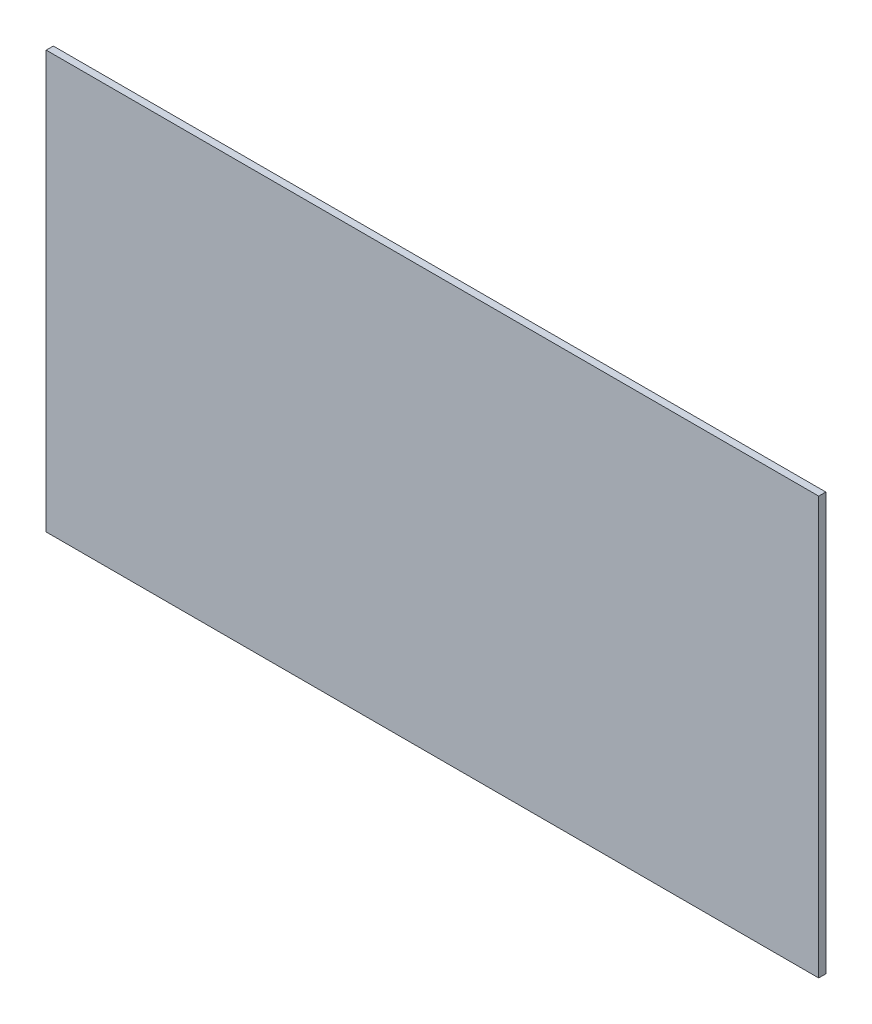
ISO-10303-21;
HEADER;
FILE_DESCRIPTION(('STEP AP214'),'2;1');
FILE_NAME('part.step','',(''),(''),'','','');
FILE_SCHEMA(('AUTOMOTIVE_DESIGN { 1 0 10303 214 1 1 1 1 }'));
ENDSEC;
DATA;
#1=APPLICATION_CONTEXT('core data for automotive mechanical design processes');
#2=APPLICATION_PROTOCOL_DEFINITION('international standard','automotive_design',2000,#1);
#3=PRODUCT_CONTEXT('',#1,'mechanical');
#4=PRODUCT('Part','Part','',(#3));
#5=PRODUCT_RELATED_PRODUCT_CATEGORY('part','',(#4));
#6=PRODUCT_DEFINITION_FORMATION('','',#4);
#7=PRODUCT_DEFINITION_CONTEXT('part definition',#1,'design');
#8=PRODUCT_DEFINITION('design','',#6,#7);
#9=PRODUCT_DEFINITION_SHAPE('','',#8);
#10=(LENGTH_UNIT() NAMED_UNIT(*) SI_UNIT(.MILLI.,.METRE.));
#11=(NAMED_UNIT(*) PLANE_ANGLE_UNIT() SI_UNIT($,.RADIAN.));
#12=(NAMED_UNIT(*) SI_UNIT($,.STERADIAN.) SOLID_ANGLE_UNIT());
#13=UNCERTAINTY_MEASURE_WITH_UNIT(LENGTH_MEASURE(1.E-05),#10,'distance_accuracy_value','');
#14=(GEOMETRIC_REPRESENTATION_CONTEXT(3) GLOBAL_UNCERTAINTY_ASSIGNED_CONTEXT((#13)) GLOBAL_UNIT_ASSIGNED_CONTEXT((#10,
#11,#12)) REPRESENTATION_CONTEXT('',''));
#15=CARTESIAN_POINT('',(0.,0.,0.));
#16=DIRECTION('',(0.,0.,1.));
#17=DIRECTION('',(1.,0.,0.));
#18=AXIS2_PLACEMENT_3D('',#15,#16,#17);
#19=CARTESIAN_POINT('',(217.5,117.5,4.));
#20=DIRECTION('',(-1.,0.,0.));
#21=DIRECTION('',(0.,0.,1.));
#22=AXIS2_PLACEMENT_3D('',#19,#20,#21);
#23=PLANE('',#22);
#24=DIRECTION('',(0.,1.,0.));
#25=VECTOR('',#24,1.);
#26=CARTESIAN_POINT('',(217.5,117.5,0.));
#27=LINE('',#26,#25);
#28=CARTESIAN_POINT('',(217.5,-117.5,0.));
#29=VERTEX_POINT('',#28);
#30=CARTESIAN_POINT('',(217.5,117.5,0.));
#31=VERTEX_POINT('',#30);
#32=EDGE_CURVE('E95',#29,#31,#27,.T.);
#33=ORIENTED_EDGE('',*,*,#32,.T.);
#34=DIRECTION('',(0.,0.,-1.));
#35=VECTOR('',#34,1.);
#36=CARTESIAN_POINT('',(217.5,117.5,4.));
#37=LINE('',#36,#35);
#38=CARTESIAN_POINT('',(217.5,117.5,4.));
#39=VERTEX_POINT('',#38);
#40=EDGE_CURVE('E11',#39,#31,#37,.T.);
#41=ORIENTED_EDGE('',*,*,#40,.F.);
#42=DIRECTION('',(0.,1.,0.));
#43=VECTOR('',#42,1.);
#44=CARTESIAN_POINT('',(217.5,117.5,4.));
#45=LINE('',#44,#43);
#46=CARTESIAN_POINT('',(217.5,-117.5,4.));
#47=VERTEX_POINT('',#46);
#48=EDGE_CURVE('E83',#47,#39,#45,.T.);
#49=ORIENTED_EDGE('',*,*,#48,.F.);
#50=DIRECTION('',(0.,0.,-1.));
#51=VECTOR('',#50,1.);
#52=CARTESIAN_POINT('',(217.5,-117.5,4.));
#53=LINE('',#52,#51);
#54=EDGE_CURVE('E91',#47,#29,#53,.T.);
#55=ORIENTED_EDGE('',*,*,#54,.T.);
#56=EDGE_LOOP('',(#33,#41,#49,#55));
#57=FACE_BOUND('',#56,.T.);
#58=ADVANCED_FACE('F32',(#57),#23,.F.);
#59=CARTESIAN_POINT('',(-217.5,117.5,4.));
#60=DIRECTION('',(0.,-1.,0.));
#61=DIRECTION('',(0.,0.,-1.));
#62=AXIS2_PLACEMENT_3D('',#59,#60,#61);
#63=PLANE('',#62);
#64=DIRECTION('',(-1.,0.,0.));
#65=VECTOR('',#64,1.);
#66=CARTESIAN_POINT('',(-217.5,117.5,0.));
#67=LINE('',#66,#65);
#68=CARTESIAN_POINT('',(-217.5,117.5,0.));
#69=VERTEX_POINT('',#68);
#70=EDGE_CURVE('E87',#31,#69,#67,.T.);
#71=ORIENTED_EDGE('',*,*,#70,.T.);
#72=DIRECTION('',(0.,0.,-1.));
#73=VECTOR('',#72,1.);
#74=CARTESIAN_POINT('',(-217.5,117.5,4.));
#75=LINE('',#74,#73);
#76=CARTESIAN_POINT('',(-217.5,117.5,4.));
#77=VERTEX_POINT('',#76);
#78=EDGE_CURVE('E40',#77,#69,#75,.T.);
#79=ORIENTED_EDGE('',*,*,#78,.F.);
#80=DIRECTION('',(-1.,0.,0.));
#81=VECTOR('',#80,1.);
#82=CARTESIAN_POINT('',(-217.5,117.5,4.));
#83=LINE('',#82,#81);
#84=EDGE_CURVE('E78',#39,#77,#83,.T.);
#85=ORIENTED_EDGE('',*,*,#84,.F.);
#86=ORIENTED_EDGE('',*,*,#40,.T.);
#87=EDGE_LOOP('',(#71,#79,#85,#86));
#88=FACE_BOUND('',#87,.T.);
#89=ADVANCED_FACE('F86',(#88),#63,.F.);
#90=CARTESIAN_POINT('',(-217.5,117.5,4.));
#91=DIRECTION('',(1.,0.,0.));
#92=DIRECTION('',(0.,0.,-1.));
#93=AXIS2_PLACEMENT_3D('',#90,#91,#92);
#94=PLANE('',#93);
#95=DIRECTION('',(0.,-1.,0.));
#96=VECTOR('',#95,1.);
#97=CARTESIAN_POINT('',(-217.5,117.5,0.));
#98=LINE('',#97,#96);
#99=CARTESIAN_POINT('',(-217.5,-117.5,0.));
#100=VERTEX_POINT('',#99);
#101=EDGE_CURVE('E65',#69,#100,#98,.T.);
#102=ORIENTED_EDGE('',*,*,#101,.T.);
#103=DIRECTION('',(0.,0.,-1.));
#104=VECTOR('',#103,1.);
#105=CARTESIAN_POINT('',(-217.5,-117.5,4.));
#106=LINE('',#105,#104);
#107=CARTESIAN_POINT('',(-217.5,-117.5,4.));
#108=VERTEX_POINT('',#107);
#109=EDGE_CURVE('E88',#108,#100,#106,.T.);
#110=ORIENTED_EDGE('',*,*,#109,.F.);
#111=DIRECTION('',(0.,-1.,0.));
#112=VECTOR('',#111,1.);
#113=CARTESIAN_POINT('',(-217.5,117.5,4.));
#114=LINE('',#113,#112);
#115=EDGE_CURVE('E81',#77,#108,#114,.T.);
#116=ORIENTED_EDGE('',*,*,#115,.F.);
#117=ORIENTED_EDGE('',*,*,#78,.T.);
#118=EDGE_LOOP('',(#102,#110,#116,#117));
#119=FACE_BOUND('',#118,.T.);
#120=ADVANCED_FACE('F89',(#119),#94,.F.);
#121=CARTESIAN_POINT('',(-217.5,-117.5,4.));
#122=DIRECTION('',(0.,1.,0.));
#123=DIRECTION('',(0.,0.,1.));
#124=AXIS2_PLACEMENT_3D('',#121,#122,#123);
#125=PLANE('',#124);
#126=DIRECTION('',(1.,0.,0.));
#127=VECTOR('',#126,1.);
#128=CARTESIAN_POINT('',(-217.5,-117.5,0.));
#129=LINE('',#128,#127);
#130=EDGE_CURVE('E71',#100,#29,#129,.T.);
#131=ORIENTED_EDGE('',*,*,#130,.T.);
#132=ORIENTED_EDGE('',*,*,#54,.F.);
#133=DIRECTION('',(1.,0.,0.));
#134=VECTOR('',#133,1.);
#135=CARTESIAN_POINT('',(-217.5,-117.5,4.));
#136=LINE('',#135,#134);
#137=EDGE_CURVE('E48',#108,#47,#136,.T.);
#138=ORIENTED_EDGE('',*,*,#137,.F.);
#139=ORIENTED_EDGE('',*,*,#109,.T.);
#140=EDGE_LOOP('',(#131,#132,#138,#139));
#141=FACE_BOUND('',#140,.T.);
#142=ADVANCED_FACE('F102',(#141),#125,.F.);
#143=CARTESIAN_POINT('',(0.,0.,4.));
#144=DIRECTION('',(0.,0.,1.));
#145=DIRECTION('',(1.,0.,0.));
#146=AXIS2_PLACEMENT_3D('',#143,#144,#145);
#147=PLANE('',#146);
#148=ORIENTED_EDGE('',*,*,#48,.T.);
#149=ORIENTED_EDGE('',*,*,#84,.T.);
#150=ORIENTED_EDGE('',*,*,#115,.T.);
#151=ORIENTED_EDGE('',*,*,#137,.T.);
#152=EDGE_LOOP('',(#148,#149,#150,#151));
#153=FACE_BOUND('',#152,.T.);
#154=ADVANCED_FACE('F79',(#153),#147,.T.);
#155=CARTESIAN_POINT('',(0.,0.,0.));
#156=DIRECTION('',(0.,0.,1.));
#157=DIRECTION('',(1.,0.,0.));
#158=AXIS2_PLACEMENT_3D('',#155,#156,#157);
#159=PLANE('',#158);
#160=ORIENTED_EDGE('',*,*,#32,.F.);
#161=ORIENTED_EDGE('',*,*,#130,.F.);
#162=ORIENTED_EDGE('',*,*,#101,.F.);
#163=ORIENTED_EDGE('',*,*,#70,.F.);
#164=EDGE_LOOP('',(#160,#161,#162,#163));
#165=FACE_BOUND('',#164,.T.);
#166=ADVANCED_FACE('F105',(#165),#159,.F.);
#167=CLOSED_SHELL('',(#58,#89,#120,#142,#154,#166));
#168=MANIFOLD_SOLID_BREP('B2',#167);
#169=ADVANCED_BREP_SHAPE_REPRESENTATION('',(#18,#168),#14);
#170=SHAPE_DEFINITION_REPRESENTATION(#9,#169);
ENDSEC;
END-ISO-10303-21;
